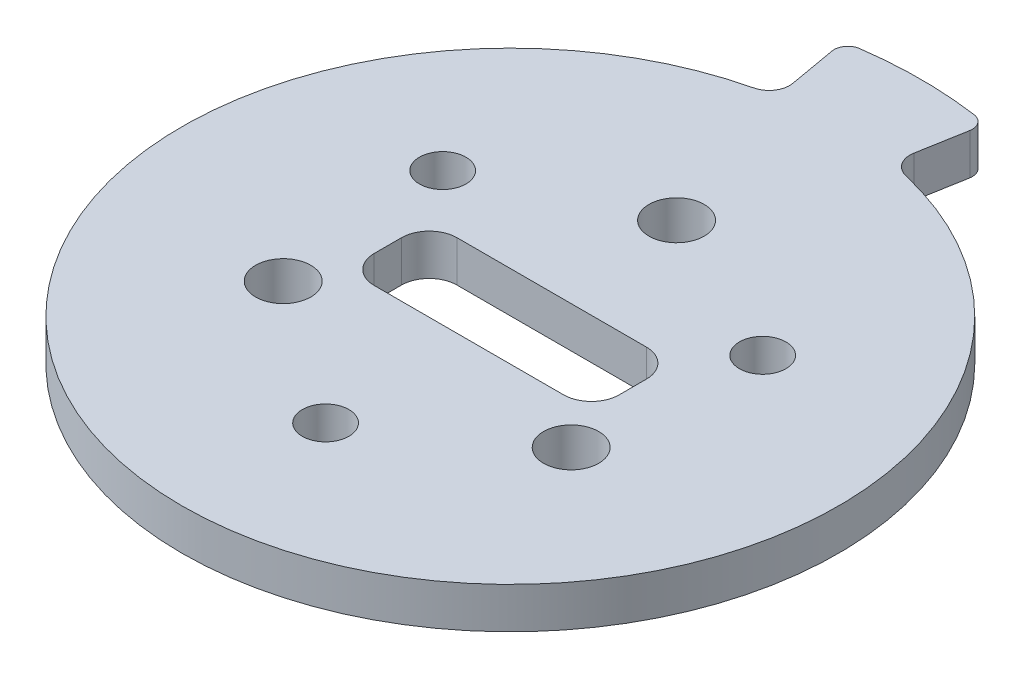
ISO-10303-21;
HEADER;
FILE_DESCRIPTION(('STEP AP214'),'2;1');
FILE_NAME('part.step','',(''),(''),'','','');
FILE_SCHEMA(('AUTOMOTIVE_DESIGN { 1 0 10303 214 1 1 1 1 }'));
ENDSEC;
DATA;
#1=APPLICATION_CONTEXT('core data for automotive mechanical design processes');
#2=APPLICATION_PROTOCOL_DEFINITION('international standard','automotive_design',2000,#1);
#3=PRODUCT_CONTEXT('',#1,'mechanical');
#4=PRODUCT('Part','Part','',(#3));
#5=PRODUCT_RELATED_PRODUCT_CATEGORY('part','',(#4));
#6=PRODUCT_DEFINITION_FORMATION('','',#4);
#7=PRODUCT_DEFINITION_CONTEXT('part definition',#1,'design');
#8=PRODUCT_DEFINITION('design','',#6,#7);
#9=PRODUCT_DEFINITION_SHAPE('','',#8);
#10=(LENGTH_UNIT() NAMED_UNIT(*) SI_UNIT(.MILLI.,.METRE.));
#11=(NAMED_UNIT(*) PLANE_ANGLE_UNIT() SI_UNIT($,.RADIAN.));
#12=(NAMED_UNIT(*) SI_UNIT($,.STERADIAN.) SOLID_ANGLE_UNIT());
#13=UNCERTAINTY_MEASURE_WITH_UNIT(LENGTH_MEASURE(1.E-05),#10,'distance_accuracy_value','');
#14=(GEOMETRIC_REPRESENTATION_CONTEXT(3) GLOBAL_UNCERTAINTY_ASSIGNED_CONTEXT((#13)) GLOBAL_UNIT_ASSIGNED_CONTEXT((#10,
#11,#12)) REPRESENTATION_CONTEXT('',''));
#15=CARTESIAN_POINT('',(0.,0.,0.));
#16=DIRECTION('',(0.,0.,1.));
#17=DIRECTION('',(1.,0.,0.));
#18=AXIS2_PLACEMENT_3D('',#15,#16,#17);
#19=CARTESIAN_POINT('',(0.,3.,0.));
#20=DIRECTION('',(0.,-1.,0.));
#21=DIRECTION('',(0.,0.,-1.));
#22=AXIS2_PLACEMENT_3D('',#19,#20,#21);
#23=CYLINDRICAL_SURFACE('',#22,30.);
#24=CARTESIAN_POINT('',(0.,3.,0.));
#25=DIRECTION('',(0.,1.,0.));
#26=DIRECTION('',(0.,0.,1.));
#27=AXIS2_PLACEMENT_3D('',#24,#25,#26);
#28=CIRCLE('',#27,30.);
#29=CARTESIAN_POINT('',(4.18758059452682,3.,-29.7062984695896));
#30=VERTEX_POINT('',#29);
#31=CARTESIAN_POINT('',(-4.18758059452682,3.,-29.7062984695896));
#32=VERTEX_POINT('',#31);
#33=EDGE_CURVE('E234',#30,#32,#28,.T.);
#34=ORIENTED_EDGE('',*,*,#33,.F.);
#35=DIRECTION('',(0.,-1.,0.));
#36=VECTOR('',#35,1.);
#37=CARTESIAN_POINT('',(4.18758059452682,3.,-29.7062984695896));
#38=LINE('',#37,#36);
#39=CARTESIAN_POINT('',(4.18758059452682,0.,-29.7062984695896));
#40=VERTEX_POINT('',#39);
#41=EDGE_CURVE('E257',#30,#40,#38,.T.);
#42=ORIENTED_EDGE('',*,*,#41,.T.);
#43=CARTESIAN_POINT('',(0.,0.,0.));
#44=DIRECTION('',(0.,1.,0.));
#45=DIRECTION('',(0.,0.,1.));
#46=AXIS2_PLACEMENT_3D('',#43,#44,#45);
#47=CIRCLE('',#46,30.);
#48=CARTESIAN_POINT('',(-4.18758059452682,0.,-29.7062984695896));
#49=VERTEX_POINT('',#48);
#50=EDGE_CURVE('E199',#40,#49,#47,.T.);
#51=ORIENTED_EDGE('',*,*,#50,.T.);
#52=DIRECTION('',(0.,-1.,0.));
#53=VECTOR('',#52,1.);
#54=CARTESIAN_POINT('',(-4.18758059452682,3.,-29.7062984695896));
#55=LINE('',#54,#53);
#56=EDGE_CURVE('E254',#49,#32,#55,.F.);
#57=ORIENTED_EDGE('',*,*,#56,.T.);
#58=EDGE_LOOP('',(#34,#42,#51,#57));
#59=FACE_BOUND('',#58,.T.);
#60=ADVANCED_FACE('F45',(#59),#23,.T.);
#61=CARTESIAN_POINT('',(0.,3.,0.));
#62=DIRECTION('',(0.,1.,0.));
#63=DIRECTION('',(0.,0.,1.));
#64=AXIS2_PLACEMENT_3D('',#61,#62,#63);
#65=PLANE('',#64);
#66=DIRECTION('',(0.,0.,-1.));
#67=VECTOR('',#66,1.);
#68=CARTESIAN_POINT('',(8.95,3.,-3.025));
#69=LINE('',#68,#67);
#70=CARTESIAN_POINT('',(8.95,3.,0.995));
#71=VERTEX_POINT('',#70);
#72=CARTESIAN_POINT('',(8.95,3.,-0.995));
#73=VERTEX_POINT('',#72);
#74=EDGE_CURVE('E319',#71,#73,#69,.T.);
#75=ORIENTED_EDGE('',*,*,#74,.F.);
#76=CARTESIAN_POINT('',(6.92,3.,0.995));
#77=DIRECTION('',(0.,1.,0.));
#78=DIRECTION('',(0.,0.,1.));
#79=AXIS2_PLACEMENT_3D('',#76,#77,#78);
#80=CIRCLE('',#79,2.03);
#81=CARTESIAN_POINT('',(6.91999999999999,3.,3.025));
#82=VERTEX_POINT('',#81);
#83=EDGE_CURVE('E294',#71,#82,#80,.F.);
#84=ORIENTED_EDGE('',*,*,#83,.T.);
#85=DIRECTION('',(1.,0.,0.));
#86=VECTOR('',#85,1.);
#87=CARTESIAN_POINT('',(-8.95,3.,3.025));
#88=LINE('',#87,#86);
#89=CARTESIAN_POINT('',(-6.92,3.,3.025));
#90=VERTEX_POINT('',#89);
#91=EDGE_CURVE('E192',#90,#82,#88,.T.);
#92=ORIENTED_EDGE('',*,*,#91,.F.);
#93=CARTESIAN_POINT('',(-6.92,3.,0.995));
#94=DIRECTION('',(0.,1.,0.));
#95=DIRECTION('',(0.,0.,1.));
#96=AXIS2_PLACEMENT_3D('',#93,#94,#95);
#97=CIRCLE('',#96,2.03);
#98=CARTESIAN_POINT('',(-8.95,3.,0.995));
#99=VERTEX_POINT('',#98);
#100=EDGE_CURVE('E302',#90,#99,#97,.F.);
#101=ORIENTED_EDGE('',*,*,#100,.T.);
#102=DIRECTION('',(0.,0.,1.));
#103=VECTOR('',#102,1.);
#104=CARTESIAN_POINT('',(-8.95,3.,-3.025));
#105=LINE('',#104,#103);
#106=CARTESIAN_POINT('',(-8.95,3.,-0.995));
#107=VERTEX_POINT('',#106);
#108=EDGE_CURVE('E311',#107,#99,#105,.T.);
#109=ORIENTED_EDGE('',*,*,#108,.F.);
#110=CARTESIAN_POINT('',(-6.92,3.,-0.995));
#111=DIRECTION('',(0.,1.,0.));
#112=DIRECTION('',(0.,0.,1.));
#113=AXIS2_PLACEMENT_3D('',#110,#111,#112);
#114=CIRCLE('',#113,2.03);
#115=CARTESIAN_POINT('',(-6.92,3.,-3.025));
#116=VERTEX_POINT('',#115);
#117=EDGE_CURVE('E53',#107,#116,#114,.F.);
#118=ORIENTED_EDGE('',*,*,#117,.T.);
#119=DIRECTION('',(-1.,0.,0.));
#120=VECTOR('',#119,1.);
#121=CARTESIAN_POINT('',(-8.95,3.,-3.025));
#122=LINE('',#121,#120);
#123=CARTESIAN_POINT('',(6.91999999999999,3.,-3.025));
#124=VERTEX_POINT('',#123);
#125=EDGE_CURVE('E310',#124,#116,#122,.T.);
#126=ORIENTED_EDGE('',*,*,#125,.F.);
#127=CARTESIAN_POINT('',(6.92,3.,-0.995));
#128=DIRECTION('',(0.,1.,0.));
#129=DIRECTION('',(0.,0.,1.));
#130=AXIS2_PLACEMENT_3D('',#127,#128,#129);
#131=CIRCLE('',#130,2.03);
#132=EDGE_CURVE('E298',#124,#73,#131,.F.);
#133=ORIENTED_EDGE('',*,*,#132,.T.);
#134=EDGE_LOOP('',(#75,#84,#92,#101,#109,#118,#126,#133));
#135=FACE_BOUND('',#134,.T.);
#136=DIRECTION('',(-0.173648177666931,0.,0.984807753012208));
#137=VECTOR('',#136,1.);
#138=CARTESIAN_POINT('',(5.20944533000792,3.,-29.5442325903662));
#139=LINE('',#138,#137);
#140=CARTESIAN_POINT('',(5.03280232772146,3.,-28.5424403429364));
#141=VERTEX_POINT('',#140);
#142=CARTESIAN_POINT('',(4.42036094288303,3.,-25.0691126515207));
#143=VERTEX_POINT('',#142);
#144=EDGE_CURVE('E187',#141,#143,#139,.T.);
#145=ORIENTED_EDGE('',*,*,#144,.F.);
#146=CARTESIAN_POINT('',(4.04799457470926,3.,-28.7160885206033));
#147=DIRECTION('',(0.,1.,0.));
#148=DIRECTION('',(0.,0.,1.));
#149=AXIS2_PLACEMENT_3D('',#146,#147,#148);
#150=CIRCLE('',#149,1.);
#151=EDGE_CURVE('E252',#141,#30,#150,.T.);
#152=ORIENTED_EDGE('',*,*,#151,.T.);
#153=ORIENTED_EDGE('',*,*,#33,.T.);
#154=CARTESIAN_POINT('',(-4.04799457470926,3.,-28.7160885206033));
#155=DIRECTION('',(0.,1.,0.));
#156=DIRECTION('',(0.,0.,1.));
#157=AXIS2_PLACEMENT_3D('',#154,#155,#156);
#158=CIRCLE('',#157,1.);
#159=CARTESIAN_POINT('',(-5.03280232772146,3.,-28.5424403429364));
#160=VERTEX_POINT('',#159);
#161=EDGE_CURVE('E250',#32,#160,#158,.T.);
#162=ORIENTED_EDGE('',*,*,#161,.T.);
#163=DIRECTION('',(-0.173648177666931,0.,-0.984807753012208));
#164=VECTOR('',#163,1.);
#165=CARTESIAN_POINT('',(-5.20944533000792,3.,-29.5442325903662));
#166=LINE('',#165,#164);
#167=CARTESIAN_POINT('',(-4.42036094288303,3.,-25.0691126515207));
#168=VERTEX_POINT('',#167);
#169=EDGE_CURVE('E186',#168,#160,#166,.T.);
#170=ORIENTED_EDGE('',*,*,#169,.F.);
#171=CARTESIAN_POINT('',(-5.89757257240134,3.,-24.8086403850203));
#172=DIRECTION('',(0.,1.,0.));
#173=DIRECTION('',(0.,0.,1.));
#174=AXIS2_PLACEMENT_3D('',#171,#172,#173);
#175=CIRCLE('',#174,1.5);
#176=CARTESIAN_POINT('',(-5.55065653873068,3.,-23.3493085976661));
#177=VERTEX_POINT('',#176);
#178=EDGE_CURVE('E185',#168,#177,#175,.F.);
#179=ORIENTED_EDGE('',*,*,#178,.T.);
#180=CARTESIAN_POINT('',(0.,3.,0.));
#181=DIRECTION('',(0.,-1.,0.));
#182=DIRECTION('',(0.,0.,1.));
#183=AXIS2_PLACEMENT_3D('',#180,#181,#182);
#184=CIRCLE('',#183,24.);
#185=CARTESIAN_POINT('',(5.55065653873068,3.,-23.3493085976661));
#186=VERTEX_POINT('',#185);
#187=EDGE_CURVE('E176',#186,#177,#184,.T.);
#188=ORIENTED_EDGE('',*,*,#187,.F.);
#189=CARTESIAN_POINT('',(5.89757257240134,3.,-24.8086403850203));
#190=DIRECTION('',(0.,1.,0.));
#191=DIRECTION('',(0.,0.,1.));
#192=AXIS2_PLACEMENT_3D('',#189,#190,#191);
#193=CIRCLE('',#192,1.5);
#194=EDGE_CURVE('E159',#186,#143,#193,.F.);
#195=ORIENTED_EDGE('',*,*,#194,.T.);
#196=EDGE_LOOP('',(#145,#152,#153,#162,#170,#179,#188,#195));
#197=FACE_BOUND('',#196,.T.);
#198=CARTESIAN_POINT('',(0.,3.,13.5));
#199=DIRECTION('',(0.,1.,0.));
#200=DIRECTION('',(0.,0.,1.));
#201=AXIS2_PLACEMENT_3D('',#198,#199,#200);
#202=CIRCLE('',#201,1.7);
#203=CARTESIAN_POINT('',(0.,3.,15.2));
#204=VERTEX_POINT('',#203);
#205=EDGE_CURVE('E200',#204,#204,#202,.T.);
#206=ORIENTED_EDGE('',*,*,#205,.F.);
#207=EDGE_LOOP('',(#206));
#208=FACE_BOUND('',#207,.T.);
#209=CARTESIAN_POINT('',(-10.5222086559809,3.,6.07500000000003));
#210=DIRECTION('',(0.,1.,0.));
#211=DIRECTION('',(0.,0.,1.));
#212=AXIS2_PLACEMENT_3D('',#209,#210,#211);
#213=CIRCLE('',#212,2.015);
#214=CARTESIAN_POINT('',(-10.5222086559809,3.,8.09000000000003));
#215=VERTEX_POINT('',#214);
#216=EDGE_CURVE('E211',#215,#215,#213,.T.);
#217=ORIENTED_EDGE('',*,*,#216,.F.);
#218=EDGE_LOOP('',(#217));
#219=FACE_BOUND('',#218,.T.);
#220=CARTESIAN_POINT('',(11.6913429510899,3.,-6.75));
#221=DIRECTION('',(0.,1.,0.));
#222=DIRECTION('',(0.,0.,1.));
#223=AXIS2_PLACEMENT_3D('',#220,#221,#222);
#224=CIRCLE('',#223,1.7);
#225=CARTESIAN_POINT('',(11.6913429510899,3.,-5.05));
#226=VERTEX_POINT('',#225);
#227=EDGE_CURVE('E204',#226,#226,#224,.T.);
#228=ORIENTED_EDGE('',*,*,#227,.F.);
#229=EDGE_LOOP('',(#228));
#230=FACE_BOUND('',#229,.T.);
#231=CARTESIAN_POINT('',(-11.6913429510899,3.,-6.75));
#232=DIRECTION('',(0.,1.,0.));
#233=DIRECTION('',(0.,0.,1.));
#234=AXIS2_PLACEMENT_3D('',#231,#232,#233);
#235=CIRCLE('',#234,1.7);
#236=CARTESIAN_POINT('',(-11.6913429510899,3.,-5.05));
#237=VERTEX_POINT('',#236);
#238=EDGE_CURVE('E223',#237,#237,#235,.T.);
#239=ORIENTED_EDGE('',*,*,#238,.F.);
#240=EDGE_LOOP('',(#239));
#241=FACE_BOUND('',#240,.T.);
#242=CARTESIAN_POINT('',(10.5222086559809,3.,6.07499999999997));
#243=DIRECTION('',(0.,1.,0.));
#244=DIRECTION('',(0.,0.,1.));
#245=AXIS2_PLACEMENT_3D('',#242,#243,#244);
#246=CIRCLE('',#245,2.015);
#247=CARTESIAN_POINT('',(10.5222086559809,3.,8.08999999999997));
#248=VERTEX_POINT('',#247);
#249=EDGE_CURVE('E203',#248,#248,#246,.T.);
#250=ORIENTED_EDGE('',*,*,#249,.F.);
#251=EDGE_LOOP('',(#250));
#252=FACE_BOUND('',#251,.T.);
#253=CARTESIAN_POINT('',(0.,3.,-12.15));
#254=DIRECTION('',(0.,1.,0.));
#255=DIRECTION('',(0.,0.,1.));
#256=AXIS2_PLACEMENT_3D('',#253,#254,#255);
#257=CIRCLE('',#256,2.015);
#258=CARTESIAN_POINT('',(0.,3.,-10.135));
#259=VERTEX_POINT('',#258);
#260=EDGE_CURVE('E217',#259,#259,#257,.T.);
#261=ORIENTED_EDGE('',*,*,#260,.F.);
#262=EDGE_LOOP('',(#261));
#263=FACE_BOUND('',#262,.T.);
#264=ADVANCED_FACE('F182',(#135,#197,#208,#219,#230,#241,#252,#263),#65,.T.);
#265=CARTESIAN_POINT('',(0.,0.,0.));
#266=DIRECTION('',(0.,1.,0.));
#267=DIRECTION('',(0.,0.,1.));
#268=AXIS2_PLACEMENT_3D('',#265,#266,#267);
#269=PLANE('',#268);
#270=DIRECTION('',(0.,0.,1.));
#271=VECTOR('',#270,1.);
#272=CARTESIAN_POINT('',(-8.95,0.,0.));
#273=LINE('',#272,#271);
#274=CARTESIAN_POINT('',(-8.95,0.,-0.995));
#275=VERTEX_POINT('',#274);
#276=CARTESIAN_POINT('',(-8.95,0.,0.995));
#277=VERTEX_POINT('',#276);
#278=EDGE_CURVE('E267',#275,#277,#273,.T.);
#279=ORIENTED_EDGE('',*,*,#278,.T.);
#280=CARTESIAN_POINT('',(-6.92,0.,0.995));
#281=DIRECTION('',(0.,1.,0.));
#282=DIRECTION('',(0.,0.,1.));
#283=AXIS2_PLACEMENT_3D('',#280,#281,#282);
#284=CIRCLE('',#283,2.03);
#285=CARTESIAN_POINT('',(-6.92,0.,3.025));
#286=VERTEX_POINT('',#285);
#287=EDGE_CURVE('E304',#277,#286,#284,.T.);
#288=ORIENTED_EDGE('',*,*,#287,.T.);
#289=DIRECTION('',(1.,0.,0.));
#290=VECTOR('',#289,1.);
#291=CARTESIAN_POINT('',(0.,0.,3.025));
#292=LINE('',#291,#290);
#293=CARTESIAN_POINT('',(6.92,0.,3.025));
#294=VERTEX_POINT('',#293);
#295=EDGE_CURVE('E269',#286,#294,#292,.T.);
#296=ORIENTED_EDGE('',*,*,#295,.T.);
#297=CARTESIAN_POINT('',(6.92,0.,0.995));
#298=DIRECTION('',(0.,1.,0.));
#299=DIRECTION('',(0.,0.,1.));
#300=AXIS2_PLACEMENT_3D('',#297,#298,#299);
#301=CIRCLE('',#300,2.03);
#302=CARTESIAN_POINT('',(8.95,0.,0.995));
#303=VERTEX_POINT('',#302);
#304=EDGE_CURVE('E296',#294,#303,#301,.T.);
#305=ORIENTED_EDGE('',*,*,#304,.T.);
#306=DIRECTION('',(0.,0.,-1.));
#307=VECTOR('',#306,1.);
#308=CARTESIAN_POINT('',(8.95,0.,0.));
#309=LINE('',#308,#307);
#310=CARTESIAN_POINT('',(8.95,0.,-0.995));
#311=VERTEX_POINT('',#310);
#312=EDGE_CURVE('E272',#303,#311,#309,.T.);
#313=ORIENTED_EDGE('',*,*,#312,.T.);
#314=CARTESIAN_POINT('',(6.92,0.,-0.995));
#315=DIRECTION('',(0.,1.,0.));
#316=DIRECTION('',(0.,0.,1.));
#317=AXIS2_PLACEMENT_3D('',#314,#315,#316);
#318=CIRCLE('',#317,2.03);
#319=CARTESIAN_POINT('',(6.92,0.,-3.025));
#320=VERTEX_POINT('',#319);
#321=EDGE_CURVE('E300',#311,#320,#318,.T.);
#322=ORIENTED_EDGE('',*,*,#321,.T.);
#323=DIRECTION('',(-1.,0.,0.));
#324=VECTOR('',#323,1.);
#325=CARTESIAN_POINT('',(0.,0.,-3.025));
#326=LINE('',#325,#324);
#327=CARTESIAN_POINT('',(-6.92,0.,-3.025));
#328=VERTEX_POINT('',#327);
#329=EDGE_CURVE('E265',#320,#328,#326,.T.);
#330=ORIENTED_EDGE('',*,*,#329,.T.);
#331=CARTESIAN_POINT('',(-6.92,0.,-0.995));
#332=DIRECTION('',(0.,1.,0.));
#333=DIRECTION('',(0.,0.,1.));
#334=AXIS2_PLACEMENT_3D('',#331,#332,#333);
#335=CIRCLE('',#334,2.03);
#336=EDGE_CURVE('E11',#328,#275,#335,.T.);
#337=ORIENTED_EDGE('',*,*,#336,.T.);
#338=EDGE_LOOP('',(#279,#288,#296,#305,#313,#322,#330,#337));
#339=FACE_BOUND('',#338,.T.);
#340=CARTESIAN_POINT('',(0.,0.,13.5));
#341=DIRECTION('',(0.,1.,0.));
#342=DIRECTION('',(0.,0.,1.));
#343=AXIS2_PLACEMENT_3D('',#340,#341,#342);
#344=CIRCLE('',#343,1.7);
#345=CARTESIAN_POINT('',(0.,0.,15.2));
#346=VERTEX_POINT('',#345);
#347=EDGE_CURVE('E196',#346,#346,#344,.T.);
#348=ORIENTED_EDGE('',*,*,#347,.T.);
#349=EDGE_LOOP('',(#348));
#350=FACE_BOUND('',#349,.T.);
#351=CARTESIAN_POINT('',(-10.5222086559809,0.,6.07500000000003));
#352=DIRECTION('',(0.,1.,0.));
#353=DIRECTION('',(0.,0.,1.));
#354=AXIS2_PLACEMENT_3D('',#351,#352,#353);
#355=CIRCLE('',#354,2.015);
#356=CARTESIAN_POINT('',(-10.5222086559809,0.,8.09000000000003));
#357=VERTEX_POINT('',#356);
#358=EDGE_CURVE('E214',#357,#357,#355,.T.);
#359=ORIENTED_EDGE('',*,*,#358,.T.);
#360=EDGE_LOOP('',(#359));
#361=FACE_BOUND('',#360,.T.);
#362=CARTESIAN_POINT('',(11.6913429510899,0.,-6.75));
#363=DIRECTION('',(0.,1.,0.));
#364=DIRECTION('',(0.,0.,1.));
#365=AXIS2_PLACEMENT_3D('',#362,#363,#364);
#366=CIRCLE('',#365,1.7);
#367=CARTESIAN_POINT('',(11.6913429510899,0.,-5.05));
#368=VERTEX_POINT('',#367);
#369=EDGE_CURVE('E208',#368,#368,#366,.T.);
#370=ORIENTED_EDGE('',*,*,#369,.T.);
#371=EDGE_LOOP('',(#370));
#372=FACE_BOUND('',#371,.T.);
#373=CARTESIAN_POINT('',(-11.6913429510899,0.,-6.75));
#374=DIRECTION('',(0.,1.,0.));
#375=DIRECTION('',(0.,0.,1.));
#376=AXIS2_PLACEMENT_3D('',#373,#374,#375);
#377=CIRCLE('',#376,1.7);
#378=CARTESIAN_POINT('',(-11.6913429510899,0.,-5.05));
#379=VERTEX_POINT('',#378);
#380=EDGE_CURVE('E207',#379,#379,#377,.T.);
#381=ORIENTED_EDGE('',*,*,#380,.T.);
#382=EDGE_LOOP('',(#381));
#383=FACE_BOUND('',#382,.T.);
#384=CARTESIAN_POINT('',(10.5222086559809,0.,6.07499999999997));
#385=DIRECTION('',(0.,1.,0.));
#386=DIRECTION('',(0.,0.,1.));
#387=AXIS2_PLACEMENT_3D('',#384,#385,#386);
#388=CIRCLE('',#387,2.015);
#389=CARTESIAN_POINT('',(10.5222086559809,0.,8.08999999999997));
#390=VERTEX_POINT('',#389);
#391=EDGE_CURVE('E220',#390,#390,#388,.T.);
#392=ORIENTED_EDGE('',*,*,#391,.T.);
#393=EDGE_LOOP('',(#392));
#394=FACE_BOUND('',#393,.T.);
#395=CARTESIAN_POINT('',(0.,0.,-12.15));
#396=DIRECTION('',(0.,1.,0.));
#397=DIRECTION('',(0.,0.,1.));
#398=AXIS2_PLACEMENT_3D('',#395,#396,#397);
#399=CIRCLE('',#398,2.015);
#400=CARTESIAN_POINT('',(0.,0.,-10.135));
#401=VERTEX_POINT('',#400);
#402=EDGE_CURVE('E230',#401,#401,#399,.T.);
#403=ORIENTED_EDGE('',*,*,#402,.T.);
#404=EDGE_LOOP('',(#403));
#405=FACE_BOUND('',#404,.T.);
#406=ORIENTED_EDGE('',*,*,#50,.F.);
#407=CARTESIAN_POINT('',(4.04799457470926,0.,-28.7160885206033));
#408=DIRECTION('',(0.,1.,0.));
#409=DIRECTION('',(0.,0.,1.));
#410=AXIS2_PLACEMENT_3D('',#407,#408,#409);
#411=CIRCLE('',#410,1.);
#412=CARTESIAN_POINT('',(5.03280232772146,0.,-28.5424403429364));
#413=VERTEX_POINT('',#412);
#414=EDGE_CURVE('E261',#40,#413,#411,.F.);
#415=ORIENTED_EDGE('',*,*,#414,.T.);
#416=DIRECTION('',(-0.173648177666931,0.,0.984807753012208));
#417=VECTOR('',#416,1.);
#418=CARTESIAN_POINT('',(5.20944533000792,0.,-29.5442325903662));
#419=LINE('',#418,#417);
#420=CARTESIAN_POINT('',(4.42036094288303,0.,-25.0691126515207));
#421=VERTEX_POINT('',#420);
#422=EDGE_CURVE('E190',#413,#421,#419,.T.);
#423=ORIENTED_EDGE('',*,*,#422,.T.);
#424=CARTESIAN_POINT('',(5.89757257240134,0.,-24.8086403850203));
#425=DIRECTION('',(0.,1.,0.));
#426=DIRECTION('',(0.,0.,1.));
#427=AXIS2_PLACEMENT_3D('',#424,#425,#426);
#428=CIRCLE('',#427,1.5);
#429=CARTESIAN_POINT('',(5.55065653873068,0.,-23.3493085976661));
#430=VERTEX_POINT('',#429);
#431=EDGE_CURVE('E169',#421,#430,#428,.T.);
#432=ORIENTED_EDGE('',*,*,#431,.T.);
#433=CARTESIAN_POINT('',(0.,0.,0.));
#434=DIRECTION('',(0.,-1.,0.));
#435=DIRECTION('',(0.,0.,1.));
#436=AXIS2_PLACEMENT_3D('',#433,#434,#435);
#437=CIRCLE('',#436,24.);
#438=CARTESIAN_POINT('',(-5.55065653873068,0.,-23.3493085976661));
#439=VERTEX_POINT('',#438);
#440=EDGE_CURVE('E179',#430,#439,#437,.T.);
#441=ORIENTED_EDGE('',*,*,#440,.T.);
#442=CARTESIAN_POINT('',(-5.89757257240134,0.,-24.8086403850203));
#443=DIRECTION('',(0.,1.,0.));
#444=DIRECTION('',(0.,0.,1.));
#445=AXIS2_PLACEMENT_3D('',#442,#443,#444);
#446=CIRCLE('',#445,1.5);
#447=CARTESIAN_POINT('',(-4.42036094288303,0.,-25.0691126515207));
#448=VERTEX_POINT('',#447);
#449=EDGE_CURVE('E245',#439,#448,#446,.T.);
#450=ORIENTED_EDGE('',*,*,#449,.T.);
#451=DIRECTION('',(-0.173648177666931,0.,-0.984807753012208));
#452=VECTOR('',#451,1.);
#453=CARTESIAN_POINT('',(-5.20944533000792,0.,-29.5442325903662));
#454=LINE('',#453,#452);
#455=CARTESIAN_POINT('',(-5.03280232772146,0.,-28.5424403429364));
#456=VERTEX_POINT('',#455);
#457=EDGE_CURVE('E233',#448,#456,#454,.T.);
#458=ORIENTED_EDGE('',*,*,#457,.T.);
#459=CARTESIAN_POINT('',(-4.04799457470926,0.,-28.7160885206033));
#460=DIRECTION('',(0.,1.,0.));
#461=DIRECTION('',(0.,0.,1.));
#462=AXIS2_PLACEMENT_3D('',#459,#460,#461);
#463=CIRCLE('',#462,1.);
#464=EDGE_CURVE('E259',#456,#49,#463,.F.);
#465=ORIENTED_EDGE('',*,*,#464,.T.);
#466=EDGE_LOOP('',(#406,#415,#423,#432,#441,#450,#458,#465));
#467=FACE_BOUND('',#466,.T.);
#468=ADVANCED_FACE('F323',(#339,#350,#361,#372,#383,#394,#405,#467),#269,.F.);
#469=CARTESIAN_POINT('',(0.,0.,-12.15));
#470=DIRECTION('',(0.,1.,0.));
#471=DIRECTION('',(0.,0.,1.));
#472=AXIS2_PLACEMENT_3D('',#469,#470,#471);
#473=CYLINDRICAL_SURFACE('',#472,2.015);
#474=ORIENTED_EDGE('',*,*,#402,.F.);
#475=EDGE_LOOP('',(#474));
#476=FACE_BOUND('',#475,.T.);
#477=ORIENTED_EDGE('',*,*,#260,.T.);
#478=EDGE_LOOP('',(#477));
#479=FACE_BOUND('',#478,.T.);
#480=ADVANCED_FACE('F542',(#476,#479),#473,.F.);
#481=CARTESIAN_POINT('',(10.5222086559809,0.,6.07499999999997));
#482=DIRECTION('',(0.,1.,0.));
#483=DIRECTION('',(0.,0.,1.));
#484=AXIS2_PLACEMENT_3D('',#481,#482,#483);
#485=CYLINDRICAL_SURFACE('',#484,2.015);
#486=ORIENTED_EDGE('',*,*,#391,.F.);
#487=EDGE_LOOP('',(#486));
#488=FACE_BOUND('',#487,.T.);
#489=ORIENTED_EDGE('',*,*,#249,.T.);
#490=EDGE_LOOP('',(#489));
#491=FACE_BOUND('',#490,.T.);
#492=ADVANCED_FACE('F532',(#488,#491),#485,.F.);
#493=CARTESIAN_POINT('',(-11.6913429510899,0.,-6.75));
#494=DIRECTION('',(0.,1.,0.));
#495=DIRECTION('',(0.,0.,1.));
#496=AXIS2_PLACEMENT_3D('',#493,#494,#495);
#497=CYLINDRICAL_SURFACE('',#496,1.7);
#498=ORIENTED_EDGE('',*,*,#380,.F.);
#499=EDGE_LOOP('',(#498));
#500=FACE_BOUND('',#499,.T.);
#501=ORIENTED_EDGE('',*,*,#238,.T.);
#502=EDGE_LOOP('',(#501));
#503=FACE_BOUND('',#502,.T.);
#504=ADVANCED_FACE('F522',(#500,#503),#497,.F.);
#505=CARTESIAN_POINT('',(11.6913429510899,0.,-6.75));
#506=DIRECTION('',(0.,1.,0.));
#507=DIRECTION('',(0.,0.,1.));
#508=AXIS2_PLACEMENT_3D('',#505,#506,#507);
#509=CYLINDRICAL_SURFACE('',#508,1.7);
#510=ORIENTED_EDGE('',*,*,#369,.F.);
#511=EDGE_LOOP('',(#510));
#512=FACE_BOUND('',#511,.T.);
#513=ORIENTED_EDGE('',*,*,#227,.T.);
#514=EDGE_LOOP('',(#513));
#515=FACE_BOUND('',#514,.T.);
#516=ADVANCED_FACE('F512',(#512,#515),#509,.F.);
#517=CARTESIAN_POINT('',(-10.5222086559809,0.,6.07500000000003));
#518=DIRECTION('',(0.,1.,0.));
#519=DIRECTION('',(0.,0.,1.));
#520=AXIS2_PLACEMENT_3D('',#517,#518,#519);
#521=CYLINDRICAL_SURFACE('',#520,2.015);
#522=ORIENTED_EDGE('',*,*,#358,.F.);
#523=EDGE_LOOP('',(#522));
#524=FACE_BOUND('',#523,.T.);
#525=ORIENTED_EDGE('',*,*,#216,.T.);
#526=EDGE_LOOP('',(#525));
#527=FACE_BOUND('',#526,.T.);
#528=ADVANCED_FACE('F373',(#524,#527),#521,.F.);
#529=CARTESIAN_POINT('',(0.,0.,13.5));
#530=DIRECTION('',(0.,1.,0.));
#531=DIRECTION('',(0.,0.,1.));
#532=AXIS2_PLACEMENT_3D('',#529,#530,#531);
#533=CYLINDRICAL_SURFACE('',#532,1.7);
#534=ORIENTED_EDGE('',*,*,#347,.F.);
#535=EDGE_LOOP('',(#534));
#536=FACE_BOUND('',#535,.T.);
#537=ORIENTED_EDGE('',*,*,#205,.T.);
#538=EDGE_LOOP('',(#537));
#539=FACE_BOUND('',#538,.T.);
#540=ADVANCED_FACE('F364',(#536,#539),#533,.F.);
#541=CARTESIAN_POINT('',(-5.20944533000792,0.,-29.5442325903662));
#542=DIRECTION('',(0.984807753012208,0.,-0.173648177666931));
#543=DIRECTION('',(-0.173648177666931,0.,-0.984807753012208));
#544=AXIS2_PLACEMENT_3D('',#541,#542,#543);
#545=PLANE('',#544);
#546=ORIENTED_EDGE('',*,*,#169,.T.);
#547=DIRECTION('',(0.,-1.,0.));
#548=VECTOR('',#547,1.);
#549=CARTESIAN_POINT('',(-5.03280232772146,0.,-28.5424403429364));
#550=LINE('',#549,#548);
#551=EDGE_CURVE('E263',#160,#456,#550,.T.);
#552=ORIENTED_EDGE('',*,*,#551,.T.);
#553=ORIENTED_EDGE('',*,*,#457,.F.);
#554=DIRECTION('',(0.,-1.,0.));
#555=VECTOR('',#554,1.);
#556=CARTESIAN_POINT('',(-4.42036094288303,3.,-25.0691126515207));
#557=LINE('',#556,#555);
#558=EDGE_CURVE('E170',#448,#168,#557,.F.);
#559=ORIENTED_EDGE('',*,*,#558,.T.);
#560=EDGE_LOOP('',(#546,#552,#553,#559));
#561=FACE_BOUND('',#560,.T.);
#562=ADVANCED_FACE('F362',(#561),#545,.F.);
#563=CARTESIAN_POINT('',(0.,0.,0.));
#564=DIRECTION('',(0.,1.,0.));
#565=DIRECTION('',(0.,0.,1.));
#566=AXIS2_PLACEMENT_3D('',#563,#564,#565);
#567=CYLINDRICAL_SURFACE('',#566,24.);
#568=ORIENTED_EDGE('',*,*,#440,.F.);
#569=DIRECTION('',(0.,1.,0.));
#570=VECTOR('',#569,1.);
#571=CARTESIAN_POINT('',(5.55065653873068,0.,-23.3493085976661));
#572=LINE('',#571,#570);
#573=EDGE_CURVE('E163',#430,#186,#572,.T.);
#574=ORIENTED_EDGE('',*,*,#573,.T.);
#575=ORIENTED_EDGE('',*,*,#187,.T.);
#576=DIRECTION('',(0.,1.,0.));
#577=VECTOR('',#576,1.);
#578=CARTESIAN_POINT('',(-5.55065653873068,0.,-23.3493085976661));
#579=LINE('',#578,#577);
#580=EDGE_CURVE('E180',#177,#439,#579,.F.);
#581=ORIENTED_EDGE('',*,*,#580,.T.);
#582=EDGE_LOOP('',(#568,#574,#575,#581));
#583=FACE_BOUND('',#582,.T.);
#584=ADVANCED_FACE('F175',(#583),#567,.T.);
#585=CARTESIAN_POINT('',(5.20944533000792,0.,-29.5442325903662));
#586=DIRECTION('',(-0.984807753012208,0.,-0.173648177666931));
#587=DIRECTION('',(-0.173648177666931,0.,0.984807753012208));
#588=AXIS2_PLACEMENT_3D('',#585,#586,#587);
#589=PLANE('',#588);
#590=ORIENTED_EDGE('',*,*,#422,.F.);
#591=DIRECTION('',(0.,-1.,0.));
#592=VECTOR('',#591,1.);
#593=CARTESIAN_POINT('',(5.03280232772146,0.,-28.5424403429364));
#594=LINE('',#593,#592);
#595=EDGE_CURVE('E247',#413,#141,#594,.F.);
#596=ORIENTED_EDGE('',*,*,#595,.T.);
#597=ORIENTED_EDGE('',*,*,#144,.T.);
#598=DIRECTION('',(0.,-1.,0.));
#599=VECTOR('',#598,1.);
#600=CARTESIAN_POINT('',(4.42036094288303,0.,-25.0691126515207));
#601=LINE('',#600,#599);
#602=EDGE_CURVE('E165',#143,#421,#601,.T.);
#603=ORIENTED_EDGE('',*,*,#602,.T.);
#604=EDGE_LOOP('',(#590,#596,#597,#603));
#605=FACE_BOUND('',#604,.T.);
#606=ADVANCED_FACE('F359',(#605),#589,.F.);
#607=CARTESIAN_POINT('',(5.89757257240134,0.,-24.8086403850203));
#608=DIRECTION('',(0.,1.,0.));
#609=DIRECTION('',(0.,0.,1.));
#610=AXIS2_PLACEMENT_3D('',#607,#608,#609);
#611=CYLINDRICAL_SURFACE('',#610,1.5);
#612=ORIENTED_EDGE('',*,*,#431,.F.);
#613=ORIENTED_EDGE('',*,*,#602,.F.);
#614=ORIENTED_EDGE('',*,*,#194,.F.);
#615=ORIENTED_EDGE('',*,*,#573,.F.);
#616=EDGE_LOOP('',(#612,#613,#614,#615));
#617=FACE_BOUND('',#616,.T.);
#618=ADVANCED_FACE('F162',(#617),#611,.F.);
#619=CARTESIAN_POINT('',(-5.89757257240134,0.,-24.8086403850203));
#620=DIRECTION('',(0.,1.,0.));
#621=DIRECTION('',(0.,0.,1.));
#622=AXIS2_PLACEMENT_3D('',#619,#620,#621);
#623=CYLINDRICAL_SURFACE('',#622,1.5);
#624=ORIENTED_EDGE('',*,*,#449,.F.);
#625=ORIENTED_EDGE('',*,*,#580,.F.);
#626=ORIENTED_EDGE('',*,*,#178,.F.);
#627=ORIENTED_EDGE('',*,*,#558,.F.);
#628=EDGE_LOOP('',(#624,#625,#626,#627));
#629=FACE_BOUND('',#628,.T.);
#630=ADVANCED_FACE('F361',(#629),#623,.F.);
#631=CARTESIAN_POINT('',(4.04799457470926,3.,-28.7160885206033));
#632=DIRECTION('',(0.,-1.,0.));
#633=DIRECTION('',(0.,0.,-1.));
#634=AXIS2_PLACEMENT_3D('',#631,#632,#633);
#635=CYLINDRICAL_SURFACE('',#634,1.);
#636=ORIENTED_EDGE('',*,*,#414,.F.);
#637=ORIENTED_EDGE('',*,*,#41,.F.);
#638=ORIENTED_EDGE('',*,*,#151,.F.);
#639=ORIENTED_EDGE('',*,*,#595,.F.);
#640=EDGE_LOOP('',(#636,#637,#638,#639));
#641=FACE_BOUND('',#640,.T.);
#642=ADVANCED_FACE('F356',(#641),#635,.T.);
#643=CARTESIAN_POINT('',(-4.04799457470926,3.,-28.7160885206033));
#644=DIRECTION('',(0.,-1.,0.));
#645=DIRECTION('',(0.,0.,-1.));
#646=AXIS2_PLACEMENT_3D('',#643,#644,#645);
#647=CYLINDRICAL_SURFACE('',#646,1.);
#648=ORIENTED_EDGE('',*,*,#464,.F.);
#649=ORIENTED_EDGE('',*,*,#551,.F.);
#650=ORIENTED_EDGE('',*,*,#161,.F.);
#651=ORIENTED_EDGE('',*,*,#56,.F.);
#652=EDGE_LOOP('',(#648,#649,#650,#651));
#653=FACE_BOUND('',#652,.T.);
#654=ADVANCED_FACE('F349',(#653),#647,.T.);
#655=CARTESIAN_POINT('',(8.95,-7.,-3.025));
#656=DIRECTION('',(1.,0.,0.));
#657=DIRECTION('',(0.,0.,-1.));
#658=AXIS2_PLACEMENT_3D('',#655,#656,#657);
#659=PLANE('',#658);
#660=ORIENTED_EDGE('',*,*,#312,.F.);
#661=DIRECTION('',(0.,1.,0.));
#662=VECTOR('',#661,1.);
#663=CARTESIAN_POINT('',(8.95,3.,0.995));
#664=LINE('',#663,#662);
#665=EDGE_CURVE('E277',#303,#71,#664,.T.);
#666=ORIENTED_EDGE('',*,*,#665,.T.);
#667=ORIENTED_EDGE('',*,*,#74,.T.);
#668=DIRECTION('',(0.,1.,0.));
#669=VECTOR('',#668,1.);
#670=CARTESIAN_POINT('',(8.95,0.,-0.995));
#671=LINE('',#670,#669);
#672=EDGE_CURVE('E275',#73,#311,#671,.F.);
#673=ORIENTED_EDGE('',*,*,#672,.T.);
#674=EDGE_LOOP('',(#660,#666,#667,#673));
#675=FACE_BOUND('',#674,.T.);
#676=ADVANCED_FACE('F392',(#675),#659,.F.);
#677=CARTESIAN_POINT('',(-8.95,-7.,3.025));
#678=DIRECTION('',(0.,0.,1.));
#679=DIRECTION('',(1.,0.,0.));
#680=AXIS2_PLACEMENT_3D('',#677,#678,#679);
#681=PLANE('',#680);
#682=ORIENTED_EDGE('',*,*,#91,.T.);
#683=DIRECTION('',(0.,1.,0.));
#684=VECTOR('',#683,1.);
#685=CARTESIAN_POINT('',(6.92,0.,3.025));
#686=LINE('',#685,#684);
#687=EDGE_CURVE('E283',#82,#294,#686,.F.);
#688=ORIENTED_EDGE('',*,*,#687,.T.);
#689=ORIENTED_EDGE('',*,*,#295,.F.);
#690=DIRECTION('',(0.,1.,0.));
#691=VECTOR('',#690,1.);
#692=CARTESIAN_POINT('',(-6.92,3.,3.025));
#693=LINE('',#692,#691);
#694=EDGE_CURVE('E280',#286,#90,#693,.T.);
#695=ORIENTED_EDGE('',*,*,#694,.T.);
#696=EDGE_LOOP('',(#682,#688,#689,#695));
#697=FACE_BOUND('',#696,.T.);
#698=ADVANCED_FACE('F332',(#697),#681,.F.);
#699=CARTESIAN_POINT('',(-8.95,-7.,-3.025));
#700=DIRECTION('',(-1.,0.,0.));
#701=DIRECTION('',(0.,0.,1.));
#702=AXIS2_PLACEMENT_3D('',#699,#700,#701);
#703=PLANE('',#702);
#704=ORIENTED_EDGE('',*,*,#108,.T.);
#705=DIRECTION('',(0.,1.,0.));
#706=VECTOR('',#705,1.);
#707=CARTESIAN_POINT('',(-8.95,0.,0.995));
#708=LINE('',#707,#706);
#709=EDGE_CURVE('E60',#99,#277,#708,.F.);
#710=ORIENTED_EDGE('',*,*,#709,.T.);
#711=ORIENTED_EDGE('',*,*,#278,.F.);
#712=DIRECTION('',(0.,1.,0.));
#713=VECTOR('',#712,1.);
#714=CARTESIAN_POINT('',(-8.95,3.,-0.995));
#715=LINE('',#714,#713);
#716=EDGE_CURVE('E290',#275,#107,#715,.T.);
#717=ORIENTED_EDGE('',*,*,#716,.T.);
#718=EDGE_LOOP('',(#704,#710,#711,#717));
#719=FACE_BOUND('',#718,.T.);
#720=ADVANCED_FACE('F321',(#719),#703,.F.);
#721=CARTESIAN_POINT('',(-8.95,-7.,-3.025));
#722=DIRECTION('',(0.,0.,-1.));
#723=DIRECTION('',(-1.,0.,0.));
#724=AXIS2_PLACEMENT_3D('',#721,#722,#723);
#725=PLANE('',#724);
#726=ORIENTED_EDGE('',*,*,#329,.F.);
#727=DIRECTION('',(0.,1.,0.));
#728=VECTOR('',#727,1.);
#729=CARTESIAN_POINT('',(6.92,3.,-3.025));
#730=LINE('',#729,#728);
#731=EDGE_CURVE('E287',#320,#124,#730,.T.);
#732=ORIENTED_EDGE('',*,*,#731,.T.);
#733=ORIENTED_EDGE('',*,*,#125,.T.);
#734=DIRECTION('',(0.,1.,0.));
#735=VECTOR('',#734,1.);
#736=CARTESIAN_POINT('',(-6.92,0.,-3.025));
#737=LINE('',#736,#735);
#738=EDGE_CURVE('E285',#116,#328,#737,.F.);
#739=ORIENTED_EDGE('',*,*,#738,.T.);
#740=EDGE_LOOP('',(#726,#732,#733,#739));
#741=FACE_BOUND('',#740,.T.);
#742=ADVANCED_FACE('F317',(#741),#725,.F.);
#743=CARTESIAN_POINT('',(6.92,-7.,0.995));
#744=DIRECTION('',(0.,-1.,0.));
#745=DIRECTION('',(0.,0.,-1.));
#746=AXIS2_PLACEMENT_3D('',#743,#744,#745);
#747=CYLINDRICAL_SURFACE('',#746,2.03);
#748=ORIENTED_EDGE('',*,*,#304,.F.);
#749=ORIENTED_EDGE('',*,*,#687,.F.);
#750=ORIENTED_EDGE('',*,*,#83,.F.);
#751=ORIENTED_EDGE('',*,*,#665,.F.);
#752=EDGE_LOOP('',(#748,#749,#750,#751));
#753=FACE_BOUND('',#752,.T.);
#754=ADVANCED_FACE('F393',(#753),#747,.F.);
#755=CARTESIAN_POINT('',(6.92,-7.,-0.995));
#756=DIRECTION('',(0.,-1.,0.));
#757=DIRECTION('',(0.,0.,-1.));
#758=AXIS2_PLACEMENT_3D('',#755,#756,#757);
#759=CYLINDRICAL_SURFACE('',#758,2.03);
#760=ORIENTED_EDGE('',*,*,#321,.F.);
#761=ORIENTED_EDGE('',*,*,#672,.F.);
#762=ORIENTED_EDGE('',*,*,#132,.F.);
#763=ORIENTED_EDGE('',*,*,#731,.F.);
#764=EDGE_LOOP('',(#760,#761,#762,#763));
#765=FACE_BOUND('',#764,.T.);
#766=ADVANCED_FACE('F396',(#765),#759,.F.);
#767=CARTESIAN_POINT('',(-6.92,-7.,0.995));
#768=DIRECTION('',(0.,-1.,0.));
#769=DIRECTION('',(0.,0.,-1.));
#770=AXIS2_PLACEMENT_3D('',#767,#768,#769);
#771=CYLINDRICAL_SURFACE('',#770,2.03);
#772=ORIENTED_EDGE('',*,*,#287,.F.);
#773=ORIENTED_EDGE('',*,*,#709,.F.);
#774=ORIENTED_EDGE('',*,*,#100,.F.);
#775=ORIENTED_EDGE('',*,*,#694,.F.);
#776=EDGE_LOOP('',(#772,#773,#774,#775));
#777=FACE_BOUND('',#776,.T.);
#778=ADVANCED_FACE('F328',(#777),#771,.F.);
#779=CARTESIAN_POINT('',(-6.92,-7.,-0.995));
#780=DIRECTION('',(0.,-1.,0.));
#781=DIRECTION('',(0.,0.,-1.));
#782=AXIS2_PLACEMENT_3D('',#779,#780,#781);
#783=CYLINDRICAL_SURFACE('',#782,2.03);
#784=ORIENTED_EDGE('',*,*,#336,.F.);
#785=ORIENTED_EDGE('',*,*,#738,.F.);
#786=ORIENTED_EDGE('',*,*,#117,.F.);
#787=ORIENTED_EDGE('',*,*,#716,.F.);
#788=EDGE_LOOP('',(#784,#785,#786,#787));
#789=FACE_BOUND('',#788,.T.);
#790=ADVANCED_FACE('F47',(#789),#783,.F.);
#791=CLOSED_SHELL('',(#60,#264,#468,#480,#492,#504,#516,#528,#540,#562,#584,#606,#618,#630,#642,
#654,#676,#698,#720,#742,#754,#766,#778,#790));
#792=MANIFOLD_SOLID_BREP('B2',#791);
#793=ADVANCED_BREP_SHAPE_REPRESENTATION('',(#18,#792),#14);
#794=SHAPE_DEFINITION_REPRESENTATION(#9,#793);
ENDSEC;
END-ISO-10303-21;
